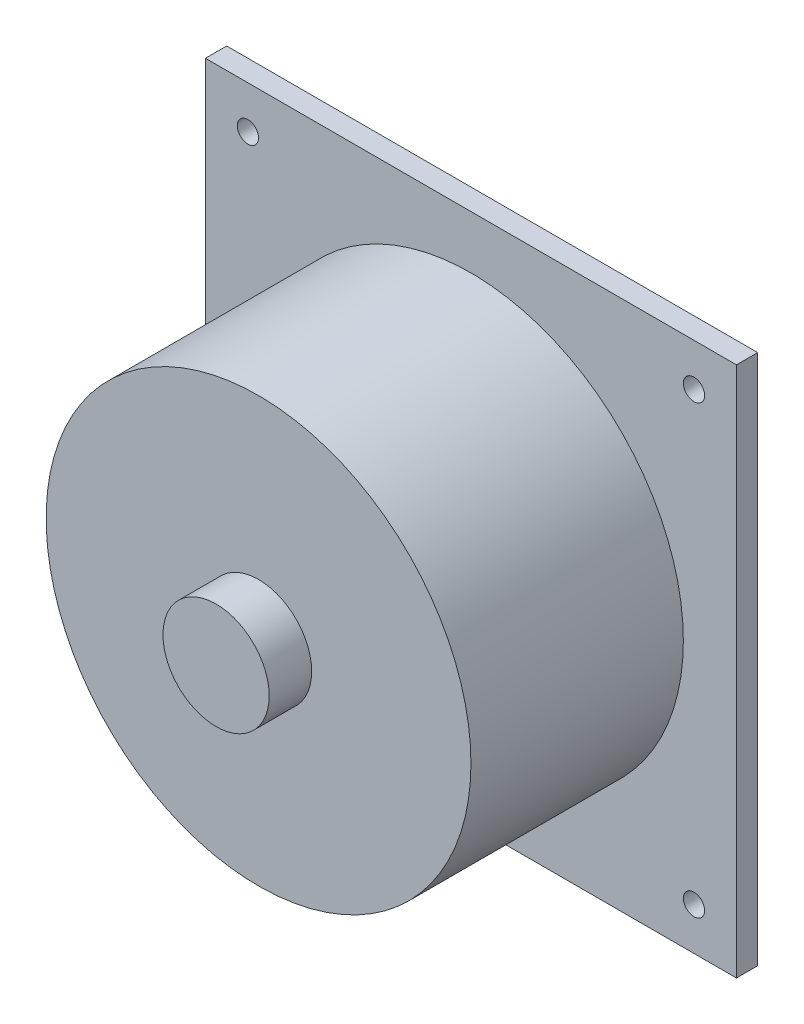
ISO-10303-21;
HEADER;
FILE_DESCRIPTION(('STEP AP214'),'2;1');
FILE_NAME('part.step','',(''),(''),'','','');
FILE_SCHEMA(('AUTOMOTIVE_DESIGN { 1 0 10303 214 1 1 1 1 }'));
ENDSEC;
DATA;
#1=APPLICATION_CONTEXT('core data for automotive mechanical design processes');
#2=APPLICATION_PROTOCOL_DEFINITION('international standard','automotive_design',2000,#1);
#3=PRODUCT_CONTEXT('',#1,'mechanical');
#4=PRODUCT('Part','Part','',(#3));
#5=PRODUCT_RELATED_PRODUCT_CATEGORY('part','',(#4));
#6=PRODUCT_DEFINITION_FORMATION('','',#4);
#7=PRODUCT_DEFINITION_CONTEXT('part definition',#1,'design');
#8=PRODUCT_DEFINITION('design','',#6,#7);
#9=PRODUCT_DEFINITION_SHAPE('','',#8);
#10=(LENGTH_UNIT() NAMED_UNIT(*) SI_UNIT(.MILLI.,.METRE.));
#11=(NAMED_UNIT(*) PLANE_ANGLE_UNIT() SI_UNIT($,.RADIAN.));
#12=(NAMED_UNIT(*) SI_UNIT($,.STERADIAN.) SOLID_ANGLE_UNIT());
#13=UNCERTAINTY_MEASURE_WITH_UNIT(LENGTH_MEASURE(1.E-05),#10,'distance_accuracy_value','');
#14=(GEOMETRIC_REPRESENTATION_CONTEXT(3) GLOBAL_UNCERTAINTY_ASSIGNED_CONTEXT((#13)) GLOBAL_UNIT_ASSIGNED_CONTEXT((#10,
#11,#12)) REPRESENTATION_CONTEXT('',''));
#15=CARTESIAN_POINT('',(0.,0.,0.));
#16=DIRECTION('',(0.,0.,1.));
#17=DIRECTION('',(1.,0.,0.));
#18=AXIS2_PLACEMENT_3D('',#15,#16,#17);
#19=CARTESIAN_POINT('',(0.,0.,550.));
#20=DIRECTION('',(0.,0.,1.));
#21=DIRECTION('',(1.,0.,0.));
#22=AXIS2_PLACEMENT_3D('',#19,#20,#21);
#23=PLANE('',#22);
#24=CARTESIAN_POINT('',(0.,0.,550.));
#25=DIRECTION('',(0.,0.,1.));
#26=DIRECTION('',(1.,0.,0.));
#27=AXIS2_PLACEMENT_3D('',#24,#25,#26);
#28=CIRCLE('',#27,500.);
#29=CARTESIAN_POINT('',(500.,0.,550.));
#30=VERTEX_POINT('',#29);
#31=EDGE_CURVE('E101',#30,#30,#28,.T.);
#32=ORIENTED_EDGE('',*,*,#31,.T.);
#33=EDGE_LOOP('',(#32));
#34=FACE_BOUND('',#33,.T.);
#35=CARTESIAN_POINT('',(0.,0.,550.));
#36=DIRECTION('',(0.,0.,1.));
#37=DIRECTION('',(1.,0.,0.));
#38=AXIS2_PLACEMENT_3D('',#35,#36,#37);
#39=CIRCLE('',#38,125.);
#40=CARTESIAN_POINT('',(125.,0.,550.));
#41=VERTEX_POINT('',#40);
#42=EDGE_CURVE('E142',#41,#41,#39,.T.);
#43=ORIENTED_EDGE('',*,*,#42,.F.);
#44=EDGE_LOOP('',(#43));
#45=FACE_BOUND('',#44,.T.);
#46=ADVANCED_FACE('F33',(#34,#45),#23,.T.);
#47=CARTESIAN_POINT('',(-625.,-625.,50.));
#48=DIRECTION('',(0.,0.,1.));
#49=DIRECTION('',(1.,0.,0.));
#50=AXIS2_PLACEMENT_3D('',#47,#48,#49);
#51=PLANE('',#50);
#52=CARTESIAN_POINT('',(525.,525.,50.));
#53=DIRECTION('',(0.,0.,1.));
#54=DIRECTION('',(1.,0.,0.));
#55=AXIS2_PLACEMENT_3D('',#52,#53,#54);
#56=CIRCLE('',#55,25.);
#57=CARTESIAN_POINT('',(550.,525.,50.));
#58=VERTEX_POINT('',#57);
#59=EDGE_CURVE('E136',#58,#58,#56,.T.);
#60=ORIENTED_EDGE('',*,*,#59,.F.);
#61=EDGE_LOOP('',(#60));
#62=FACE_BOUND('',#61,.T.);
#63=CARTESIAN_POINT('',(525.,-525.,50.));
#64=DIRECTION('',(0.,0.,1.));
#65=DIRECTION('',(1.,0.,0.));
#66=AXIS2_PLACEMENT_3D('',#63,#64,#65);
#67=CIRCLE('',#66,25.);
#68=CARTESIAN_POINT('',(550.,-525.,50.));
#69=VERTEX_POINT('',#68);
#70=EDGE_CURVE('E130',#69,#69,#67,.T.);
#71=ORIENTED_EDGE('',*,*,#70,.F.);
#72=EDGE_LOOP('',(#71));
#73=FACE_BOUND('',#72,.T.);
#74=CARTESIAN_POINT('',(-525.,-525.,50.));
#75=DIRECTION('',(0.,0.,1.));
#76=DIRECTION('',(1.,0.,0.));
#77=AXIS2_PLACEMENT_3D('',#74,#75,#76);
#78=CIRCLE('',#77,25.);
#79=CARTESIAN_POINT('',(-500.,-525.,50.));
#80=VERTEX_POINT('',#79);
#81=EDGE_CURVE('E124',#80,#80,#78,.T.);
#82=ORIENTED_EDGE('',*,*,#81,.F.);
#83=EDGE_LOOP('',(#82));
#84=FACE_BOUND('',#83,.T.);
#85=CARTESIAN_POINT('',(-525.,525.,50.));
#86=DIRECTION('',(0.,0.,1.));
#87=DIRECTION('',(1.,0.,0.));
#88=AXIS2_PLACEMENT_3D('',#85,#86,#87);
#89=CIRCLE('',#88,25.);
#90=CARTESIAN_POINT('',(-500.,525.,50.));
#91=VERTEX_POINT('',#90);
#92=EDGE_CURVE('E118',#91,#91,#89,.T.);
#93=ORIENTED_EDGE('',*,*,#92,.F.);
#94=EDGE_LOOP('',(#93));
#95=FACE_BOUND('',#94,.T.);
#96=DIRECTION('',(0.,-1.,0.));
#97=VECTOR('',#96,1.);
#98=CARTESIAN_POINT('',(-625.,625.,50.));
#99=LINE('',#98,#97);
#100=CARTESIAN_POINT('',(-625.,625.,50.));
#101=VERTEX_POINT('',#100);
#102=CARTESIAN_POINT('',(-625.,-625.,50.));
#103=VERTEX_POINT('',#102);
#104=EDGE_CURVE('E86',#101,#103,#99,.T.);
#105=ORIENTED_EDGE('',*,*,#104,.T.);
#106=DIRECTION('',(1.,0.,0.));
#107=VECTOR('',#106,1.);
#108=CARTESIAN_POINT('',(-625.,-625.,50.));
#109=LINE('',#108,#107);
#110=CARTESIAN_POINT('',(625.,-625.,50.));
#111=VERTEX_POINT('',#110);
#112=EDGE_CURVE('E80',#103,#111,#109,.T.);
#113=ORIENTED_EDGE('',*,*,#112,.T.);
#114=DIRECTION('',(0.,1.,0.));
#115=VECTOR('',#114,1.);
#116=CARTESIAN_POINT('',(625.,625.,50.));
#117=LINE('',#116,#115);
#118=CARTESIAN_POINT('',(625.,625.,50.));
#119=VERTEX_POINT('',#118);
#120=EDGE_CURVE('E84',#111,#119,#117,.T.);
#121=ORIENTED_EDGE('',*,*,#120,.T.);
#122=DIRECTION('',(-1.,0.,0.));
#123=VECTOR('',#122,1.);
#124=CARTESIAN_POINT('',(-625.,625.,50.));
#125=LINE('',#124,#123);
#126=EDGE_CURVE('E50',#119,#101,#125,.T.);
#127=ORIENTED_EDGE('',*,*,#126,.T.);
#128=EDGE_LOOP('',(#105,#113,#121,#127));
#129=FACE_BOUND('',#128,.T.);
#130=CARTESIAN_POINT('',(0.,0.,50.));
#131=DIRECTION('',(0.,0.,1.));
#132=DIRECTION('',(1.,0.,0.));
#133=AXIS2_PLACEMENT_3D('',#130,#131,#132);
#134=CIRCLE('',#133,500.);
#135=CARTESIAN_POINT('',(500.,0.,50.));
#136=VERTEX_POINT('',#135);
#137=EDGE_CURVE('E112',#136,#136,#134,.T.);
#138=ORIENTED_EDGE('',*,*,#137,.F.);
#139=EDGE_LOOP('',(#138));
#140=FACE_BOUND('',#139,.T.);
#141=ADVANCED_FACE('F81',(#62,#73,#84,#95,#129,#140),#51,.T.);
#142=CARTESIAN_POINT('',(-625.,625.,50.));
#143=DIRECTION('',(1.,0.,0.));
#144=DIRECTION('',(0.,0.,-1.));
#145=AXIS2_PLACEMENT_3D('',#142,#143,#144);
#146=PLANE('',#145);
#147=DIRECTION('',(0.,-1.,0.));
#148=VECTOR('',#147,1.);
#149=CARTESIAN_POINT('',(-625.,625.,0.));
#150=LINE('',#149,#148);
#151=CARTESIAN_POINT('',(-625.,625.,0.));
#152=VERTEX_POINT('',#151);
#153=CARTESIAN_POINT('',(-625.,-625.,0.));
#154=VERTEX_POINT('',#153);
#155=EDGE_CURVE('E98',#152,#154,#150,.T.);
#156=ORIENTED_EDGE('',*,*,#155,.T.);
#157=DIRECTION('',(0.,0.,-1.));
#158=VECTOR('',#157,1.);
#159=CARTESIAN_POINT('',(-625.,-625.,50.));
#160=LINE('',#159,#158);
#161=EDGE_CURVE('E11',#103,#154,#160,.T.);
#162=ORIENTED_EDGE('',*,*,#161,.F.);
#163=ORIENTED_EDGE('',*,*,#104,.F.);
#164=DIRECTION('',(0.,0.,-1.));
#165=VECTOR('',#164,1.);
#166=CARTESIAN_POINT('',(-625.,625.,50.));
#167=LINE('',#166,#165);
#168=EDGE_CURVE('E94',#101,#152,#167,.T.);
#169=ORIENTED_EDGE('',*,*,#168,.T.);
#170=EDGE_LOOP('',(#156,#162,#163,#169));
#171=FACE_BOUND('',#170,.T.);
#172=ADVANCED_FACE('F35',(#171),#146,.F.);
#173=CARTESIAN_POINT('',(-625.,-625.,50.));
#174=DIRECTION('',(0.,1.,0.));
#175=DIRECTION('',(0.,0.,1.));
#176=AXIS2_PLACEMENT_3D('',#173,#174,#175);
#177=PLANE('',#176);
#178=DIRECTION('',(1.,0.,0.));
#179=VECTOR('',#178,1.);
#180=CARTESIAN_POINT('',(-625.,-625.,0.));
#181=LINE('',#180,#179);
#182=CARTESIAN_POINT('',(625.,-625.,0.));
#183=VERTEX_POINT('',#182);
#184=EDGE_CURVE('E90',#154,#183,#181,.T.);
#185=ORIENTED_EDGE('',*,*,#184,.T.);
#186=DIRECTION('',(0.,0.,-1.));
#187=VECTOR('',#186,1.);
#188=CARTESIAN_POINT('',(625.,-625.,50.));
#189=LINE('',#188,#187);
#190=EDGE_CURVE('E42',#111,#183,#189,.T.);
#191=ORIENTED_EDGE('',*,*,#190,.F.);
#192=ORIENTED_EDGE('',*,*,#112,.F.);
#193=ORIENTED_EDGE('',*,*,#161,.T.);
#194=EDGE_LOOP('',(#185,#191,#192,#193));
#195=FACE_BOUND('',#194,.T.);
#196=ADVANCED_FACE('F89',(#195),#177,.F.);
#197=CARTESIAN_POINT('',(625.,625.,50.));
#198=DIRECTION('',(-1.,0.,0.));
#199=DIRECTION('',(0.,0.,1.));
#200=AXIS2_PLACEMENT_3D('',#197,#198,#199);
#201=PLANE('',#200);
#202=DIRECTION('',(0.,1.,0.));
#203=VECTOR('',#202,1.);
#204=CARTESIAN_POINT('',(625.,625.,0.));
#205=LINE('',#204,#203);
#206=CARTESIAN_POINT('',(625.,625.,0.));
#207=VERTEX_POINT('',#206);
#208=EDGE_CURVE('E67',#183,#207,#205,.T.);
#209=ORIENTED_EDGE('',*,*,#208,.T.);
#210=DIRECTION('',(0.,0.,-1.));
#211=VECTOR('',#210,1.);
#212=CARTESIAN_POINT('',(625.,625.,50.));
#213=LINE('',#212,#211);
#214=EDGE_CURVE('E91',#119,#207,#213,.T.);
#215=ORIENTED_EDGE('',*,*,#214,.F.);
#216=ORIENTED_EDGE('',*,*,#120,.F.);
#217=ORIENTED_EDGE('',*,*,#190,.T.);
#218=EDGE_LOOP('',(#209,#215,#216,#217));
#219=FACE_BOUND('',#218,.T.);
#220=ADVANCED_FACE('F92',(#219),#201,.F.);
#221=CARTESIAN_POINT('',(-625.,625.,50.));
#222=DIRECTION('',(0.,-1.,0.));
#223=DIRECTION('',(0.,0.,-1.));
#224=AXIS2_PLACEMENT_3D('',#221,#222,#223);
#225=PLANE('',#224);
#226=DIRECTION('',(-1.,0.,0.));
#227=VECTOR('',#226,1.);
#228=CARTESIAN_POINT('',(-625.,625.,0.));
#229=LINE('',#228,#227);
#230=EDGE_CURVE('E73',#207,#152,#229,.T.);
#231=ORIENTED_EDGE('',*,*,#230,.T.);
#232=ORIENTED_EDGE('',*,*,#168,.F.);
#233=ORIENTED_EDGE('',*,*,#126,.F.);
#234=ORIENTED_EDGE('',*,*,#214,.T.);
#235=EDGE_LOOP('',(#231,#232,#233,#234));
#236=FACE_BOUND('',#235,.T.);
#237=ADVANCED_FACE('F106',(#236),#225,.F.);
#238=CARTESIAN_POINT('',(-625.,-625.,0.));
#239=DIRECTION('',(0.,0.,1.));
#240=DIRECTION('',(1.,0.,0.));
#241=AXIS2_PLACEMENT_3D('',#238,#239,#240);
#242=PLANE('',#241);
#243=CARTESIAN_POINT('',(525.,525.,0.));
#244=DIRECTION('',(0.,0.,1.));
#245=DIRECTION('',(1.,0.,0.));
#246=AXIS2_PLACEMENT_3D('',#243,#244,#245);
#247=CIRCLE('',#246,25.);
#248=CARTESIAN_POINT('',(550.,525.,0.));
#249=VERTEX_POINT('',#248);
#250=EDGE_CURVE('E133',#249,#249,#247,.T.);
#251=ORIENTED_EDGE('',*,*,#250,.T.);
#252=EDGE_LOOP('',(#251));
#253=FACE_BOUND('',#252,.T.);
#254=CARTESIAN_POINT('',(525.,-525.,0.));
#255=DIRECTION('',(0.,0.,1.));
#256=DIRECTION('',(1.,0.,0.));
#257=AXIS2_PLACEMENT_3D('',#254,#255,#256);
#258=CIRCLE('',#257,25.);
#259=CARTESIAN_POINT('',(550.,-525.,0.));
#260=VERTEX_POINT('',#259);
#261=EDGE_CURVE('E127',#260,#260,#258,.T.);
#262=ORIENTED_EDGE('',*,*,#261,.T.);
#263=EDGE_LOOP('',(#262));
#264=FACE_BOUND('',#263,.T.);
#265=CARTESIAN_POINT('',(-525.,-525.,0.));
#266=DIRECTION('',(0.,0.,1.));
#267=DIRECTION('',(1.,0.,0.));
#268=AXIS2_PLACEMENT_3D('',#265,#266,#267);
#269=CIRCLE('',#268,25.);
#270=CARTESIAN_POINT('',(-500.,-525.,0.));
#271=VERTEX_POINT('',#270);
#272=EDGE_CURVE('E121',#271,#271,#269,.T.);
#273=ORIENTED_EDGE('',*,*,#272,.T.);
#274=EDGE_LOOP('',(#273));
#275=FACE_BOUND('',#274,.T.);
#276=CARTESIAN_POINT('',(-525.,525.,0.));
#277=DIRECTION('',(0.,0.,1.));
#278=DIRECTION('',(1.,0.,0.));
#279=AXIS2_PLACEMENT_3D('',#276,#277,#278);
#280=CIRCLE('',#279,25.);
#281=CARTESIAN_POINT('',(-500.,525.,0.));
#282=VERTEX_POINT('',#281);
#283=EDGE_CURVE('E115',#282,#282,#280,.T.);
#284=ORIENTED_EDGE('',*,*,#283,.T.);
#285=EDGE_LOOP('',(#284));
#286=FACE_BOUND('',#285,.T.);
#287=ORIENTED_EDGE('',*,*,#155,.F.);
#288=ORIENTED_EDGE('',*,*,#230,.F.);
#289=ORIENTED_EDGE('',*,*,#208,.F.);
#290=ORIENTED_EDGE('',*,*,#184,.F.);
#291=EDGE_LOOP('',(#287,#288,#289,#290));
#292=FACE_BOUND('',#291,.T.);
#293=ADVANCED_FACE('F109',(#253,#264,#275,#286,#292),#242,.F.);
#294=CARTESIAN_POINT('',(0.,0.,550.));
#295=DIRECTION('',(0.,0.,-1.));
#296=DIRECTION('',(-1.,0.,0.));
#297=AXIS2_PLACEMENT_3D('',#294,#295,#296);
#298=CYLINDRICAL_SURFACE('',#297,500.);
#299=ORIENTED_EDGE('',*,*,#31,.F.);
#300=EDGE_LOOP('',(#299));
#301=FACE_BOUND('',#300,.T.);
#302=ORIENTED_EDGE('',*,*,#137,.T.);
#303=EDGE_LOOP('',(#302));
#304=FACE_BOUND('',#303,.T.);
#305=ADVANCED_FACE('F169',(#301,#304),#298,.T.);
#306=CARTESIAN_POINT('',(-525.,525.,0.));
#307=DIRECTION('',(0.,0.,1.));
#308=DIRECTION('',(1.,0.,0.));
#309=AXIS2_PLACEMENT_3D('',#306,#307,#308);
#310=CYLINDRICAL_SURFACE('',#309,25.);
#311=ORIENTED_EDGE('',*,*,#283,.F.);
#312=EDGE_LOOP('',(#311));
#313=FACE_BOUND('',#312,.T.);
#314=ORIENTED_EDGE('',*,*,#92,.T.);
#315=EDGE_LOOP('',(#314));
#316=FACE_BOUND('',#315,.T.);
#317=ADVANCED_FACE('F167',(#313,#316),#310,.F.);
#318=CARTESIAN_POINT('',(-525.,-525.,0.));
#319=DIRECTION('',(0.,0.,1.));
#320=DIRECTION('',(1.,0.,0.));
#321=AXIS2_PLACEMENT_3D('',#318,#319,#320);
#322=CYLINDRICAL_SURFACE('',#321,25.);
#323=ORIENTED_EDGE('',*,*,#272,.F.);
#324=EDGE_LOOP('',(#323));
#325=FACE_BOUND('',#324,.T.);
#326=ORIENTED_EDGE('',*,*,#81,.T.);
#327=EDGE_LOOP('',(#326));
#328=FACE_BOUND('',#327,.T.);
#329=ADVANCED_FACE('F209',(#325,#328),#322,.F.);
#330=CARTESIAN_POINT('',(525.,-525.,0.));
#331=DIRECTION('',(0.,0.,1.));
#332=DIRECTION('',(1.,0.,0.));
#333=AXIS2_PLACEMENT_3D('',#330,#331,#332);
#334=CYLINDRICAL_SURFACE('',#333,25.);
#335=ORIENTED_EDGE('',*,*,#261,.F.);
#336=EDGE_LOOP('',(#335));
#337=FACE_BOUND('',#336,.T.);
#338=ORIENTED_EDGE('',*,*,#70,.T.);
#339=EDGE_LOOP('',(#338));
#340=FACE_BOUND('',#339,.T.);
#341=ADVANCED_FACE('F218',(#337,#340),#334,.F.);
#342=CARTESIAN_POINT('',(525.,525.,0.));
#343=DIRECTION('',(0.,0.,1.));
#344=DIRECTION('',(1.,0.,0.));
#345=AXIS2_PLACEMENT_3D('',#342,#343,#344);
#346=CYLINDRICAL_SURFACE('',#345,25.);
#347=ORIENTED_EDGE('',*,*,#250,.F.);
#348=EDGE_LOOP('',(#347));
#349=FACE_BOUND('',#348,.T.);
#350=ORIENTED_EDGE('',*,*,#59,.T.);
#351=EDGE_LOOP('',(#350));
#352=FACE_BOUND('',#351,.T.);
#353=ADVANCED_FACE('F153',(#349,#352),#346,.F.);
#354=CARTESIAN_POINT('',(0.,0.,650.));
#355=DIRECTION('',(0.,0.,-1.));
#356=DIRECTION('',(-1.,0.,0.));
#357=AXIS2_PLACEMENT_3D('',#354,#355,#356);
#358=CYLINDRICAL_SURFACE('',#357,125.);
#359=CARTESIAN_POINT('',(0.,0.,650.));
#360=DIRECTION('',(0.,0.,1.));
#361=DIRECTION('',(1.,0.,0.));
#362=AXIS2_PLACEMENT_3D('',#359,#360,#361);
#363=CIRCLE('',#362,125.);
#364=CARTESIAN_POINT('',(125.,0.,650.));
#365=VERTEX_POINT('',#364);
#366=EDGE_CURVE('E139',#365,#365,#363,.T.);
#367=ORIENTED_EDGE('',*,*,#366,.F.);
#368=EDGE_LOOP('',(#367));
#369=FACE_BOUND('',#368,.T.);
#370=ORIENTED_EDGE('',*,*,#42,.T.);
#371=EDGE_LOOP('',(#370));
#372=FACE_BOUND('',#371,.T.);
#373=ADVANCED_FACE('F150',(#369,#372),#358,.T.);
#374=CARTESIAN_POINT('',(0.,0.,650.));
#375=DIRECTION('',(0.,0.,1.));
#376=DIRECTION('',(1.,0.,0.));
#377=AXIS2_PLACEMENT_3D('',#374,#375,#376);
#378=PLANE('',#377);
#379=ORIENTED_EDGE('',*,*,#366,.T.);
#380=EDGE_LOOP('',(#379));
#381=FACE_BOUND('',#380,.T.);
#382=ADVANCED_FACE('F148',(#381),#378,.T.);
#383=CLOSED_SHELL('',(#46,#141,#172,#196,#220,#237,#293,#305,#317,#329,#341,#353,#373,#382));
#384=MANIFOLD_SOLID_BREP('B2',#383);
#385=ADVANCED_BREP_SHAPE_REPRESENTATION('',(#18,#384),#14);
#386=SHAPE_DEFINITION_REPRESENTATION(#9,#385);
ENDSEC;
END-ISO-10303-21;
